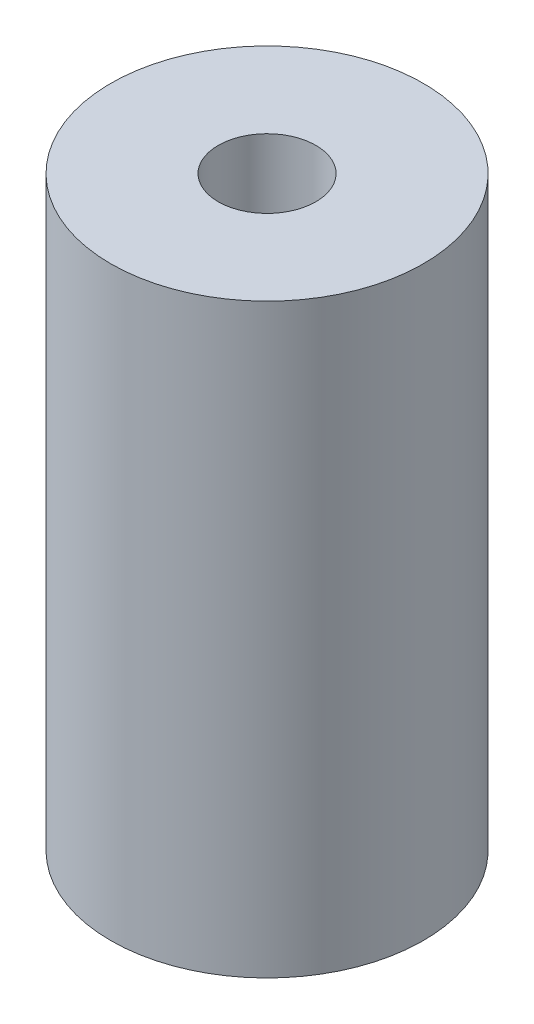
ISO-10303-21;
HEADER;
FILE_DESCRIPTION(('STEP AP214'),'2;1');
FILE_NAME('part.step','',(''),(''),'','','');
FILE_SCHEMA(('AUTOMOTIVE_DESIGN { 1 0 10303 214 1 1 1 1 }'));
ENDSEC;
DATA;
#1=APPLICATION_CONTEXT('core data for automotive mechanical design processes');
#2=APPLICATION_PROTOCOL_DEFINITION('international standard','automotive_design',2000,#1);
#3=PRODUCT_CONTEXT('',#1,'mechanical');
#4=PRODUCT('Part','Part','',(#3));
#5=PRODUCT_RELATED_PRODUCT_CATEGORY('part','',(#4));
#6=PRODUCT_DEFINITION_FORMATION('','',#4);
#7=PRODUCT_DEFINITION_CONTEXT('part definition',#1,'design');
#8=PRODUCT_DEFINITION('design','',#6,#7);
#9=PRODUCT_DEFINITION_SHAPE('','',#8);
#10=(LENGTH_UNIT() NAMED_UNIT(*) SI_UNIT(.MILLI.,.METRE.));
#11=(NAMED_UNIT(*) PLANE_ANGLE_UNIT() SI_UNIT($,.RADIAN.));
#12=(NAMED_UNIT(*) SI_UNIT($,.STERADIAN.) SOLID_ANGLE_UNIT());
#13=UNCERTAINTY_MEASURE_WITH_UNIT(LENGTH_MEASURE(1.E-05),#10,'distance_accuracy_value','');
#14=(GEOMETRIC_REPRESENTATION_CONTEXT(3) GLOBAL_UNCERTAINTY_ASSIGNED_CONTEXT((#13)) GLOBAL_UNIT_ASSIGNED_CONTEXT((#10,
#11,#12)) REPRESENTATION_CONTEXT('',''));
#15=CARTESIAN_POINT('',(0.,0.,0.));
#16=DIRECTION('',(0.,0.,1.));
#17=DIRECTION('',(1.,0.,0.));
#18=AXIS2_PLACEMENT_3D('',#15,#16,#17);
#19=CARTESIAN_POINT('',(0.,6.,0.));
#20=DIRECTION('',(0.,1.,0.));
#21=DIRECTION('',(0.,0.,1.));
#22=AXIS2_PLACEMENT_3D('',#19,#20,#21);
#23=PLANE('',#22);
#24=CARTESIAN_POINT('',(0.,6.,0.));
#25=DIRECTION('',(0.,1.,0.));
#26=DIRECTION('',(0.,0.,1.));
#27=AXIS2_PLACEMENT_3D('',#24,#25,#26);
#28=CIRCLE('',#27,1.6);
#29=CARTESIAN_POINT('',(0.,6.,1.6));
#30=VERTEX_POINT('',#29);
#31=EDGE_CURVE('E10',#30,#30,#28,.T.);
#32=ORIENTED_EDGE('',*,*,#31,.T.);
#33=EDGE_LOOP('',(#32));
#34=FACE_BOUND('',#33,.T.);
#35=CARTESIAN_POINT('',(0.,6.,0.));
#36=DIRECTION('',(0.,1.,0.));
#37=DIRECTION('',(0.,0.,1.));
#38=AXIS2_PLACEMENT_3D('',#35,#36,#37);
#39=CIRCLE('',#38,0.5);
#40=CARTESIAN_POINT('',(0.,6.,0.5));
#41=VERTEX_POINT('',#40);
#42=EDGE_CURVE('E43',#41,#41,#39,.T.);
#43=ORIENTED_EDGE('',*,*,#42,.F.);
#44=EDGE_LOOP('',(#43));
#45=FACE_BOUND('',#44,.T.);
#46=ADVANCED_FACE('F32',(#34,#45),#23,.T.);
#47=CARTESIAN_POINT('',(0.,0.,0.));
#48=DIRECTION('',(0.,1.,0.));
#49=DIRECTION('',(0.,0.,1.));
#50=AXIS2_PLACEMENT_3D('',#47,#48,#49);
#51=PLANE('',#50);
#52=CARTESIAN_POINT('',(0.,0.,0.));
#53=DIRECTION('',(0.,1.,0.));
#54=DIRECTION('',(0.,0.,1.));
#55=AXIS2_PLACEMENT_3D('',#52,#53,#54);
#56=CIRCLE('',#55,1.6);
#57=CARTESIAN_POINT('',(0.,0.,1.6));
#58=VERTEX_POINT('',#57);
#59=EDGE_CURVE('E36',#58,#58,#56,.T.);
#60=ORIENTED_EDGE('',*,*,#59,.F.);
#61=EDGE_LOOP('',(#60));
#62=FACE_BOUND('',#61,.T.);
#63=CARTESIAN_POINT('',(0.,0.,0.));
#64=DIRECTION('',(0.,1.,0.));
#65=DIRECTION('',(0.,0.,1.));
#66=AXIS2_PLACEMENT_3D('',#63,#64,#65);
#67=CIRCLE('',#66,0.5);
#68=CARTESIAN_POINT('',(0.,0.,0.5));
#69=VERTEX_POINT('',#68);
#70=EDGE_CURVE('E45',#69,#69,#67,.T.);
#71=ORIENTED_EDGE('',*,*,#70,.T.);
#72=EDGE_LOOP('',(#71));
#73=FACE_BOUND('',#72,.T.);
#74=ADVANCED_FACE('F55',(#62,#73),#51,.F.);
#75=CARTESIAN_POINT('',(0.,6.,0.));
#76=DIRECTION('',(0.,-1.,0.));
#77=DIRECTION('',(0.,0.,-1.));
#78=AXIS2_PLACEMENT_3D('',#75,#76,#77);
#79=CYLINDRICAL_SURFACE('',#78,1.6);
#80=ORIENTED_EDGE('',*,*,#31,.F.);
#81=EDGE_LOOP('',(#80));
#82=FACE_BOUND('',#81,.T.);
#83=ORIENTED_EDGE('',*,*,#59,.T.);
#84=EDGE_LOOP('',(#83));
#85=FACE_BOUND('',#84,.T.);
#86=ADVANCED_FACE('F34',(#82,#85),#79,.T.);
#87=CARTESIAN_POINT('',(0.,6.,0.));
#88=DIRECTION('',(0.,-1.,0.));
#89=DIRECTION('',(0.,0.,-1.));
#90=AXIS2_PLACEMENT_3D('',#87,#88,#89);
#91=CYLINDRICAL_SURFACE('',#90,0.5);
#92=ORIENTED_EDGE('',*,*,#42,.T.);
#93=EDGE_LOOP('',(#92));
#94=FACE_BOUND('',#93,.T.);
#95=ORIENTED_EDGE('',*,*,#70,.F.);
#96=EDGE_LOOP('',(#95));
#97=FACE_BOUND('',#96,.T.);
#98=ADVANCED_FACE('F51',(#94,#97),#91,.F.);
#99=CLOSED_SHELL('',(#46,#74,#86,#98));
#100=MANIFOLD_SOLID_BREP('B2',#99);
#101=ADVANCED_BREP_SHAPE_REPRESENTATION('',(#18,#100),#14);
#102=SHAPE_DEFINITION_REPRESENTATION(#9,#101);
ENDSEC;
END-ISO-10303-21;
